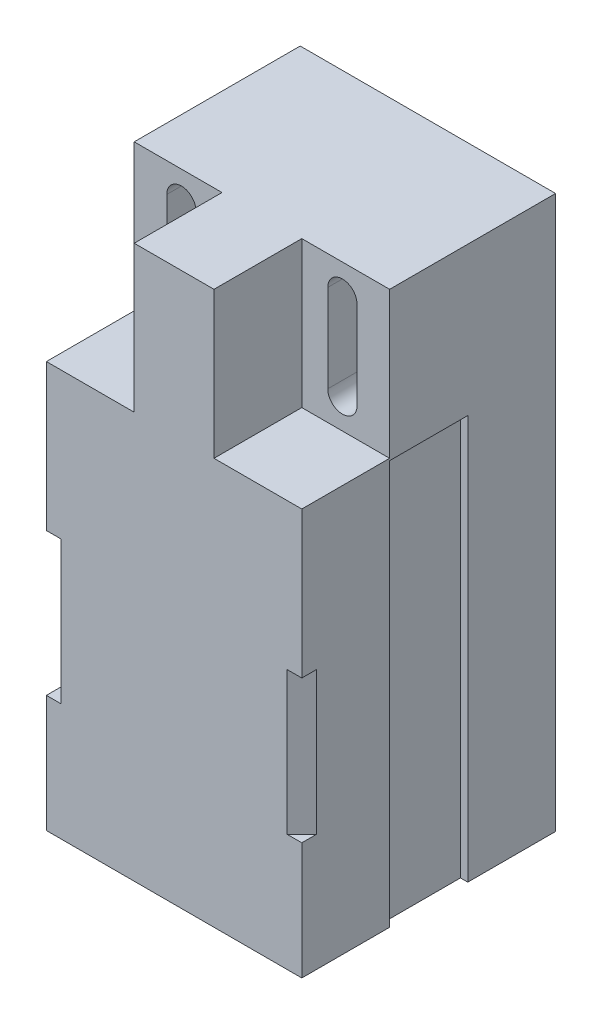
ISO-10303-21;
HEADER;
FILE_DESCRIPTION(('STEP AP214'),'2;1');
FILE_NAME('part.step','',(''),(''),'','','');
FILE_SCHEMA(('AUTOMOTIVE_DESIGN { 1 0 10303 214 1 1 1 1 }'));
ENDSEC;
DATA;
#1=APPLICATION_CONTEXT('core data for automotive mechanical design processes');
#2=APPLICATION_PROTOCOL_DEFINITION('international standard','automotive_design',2000,#1);
#3=PRODUCT_CONTEXT('',#1,'mechanical');
#4=PRODUCT('Part','Part','',(#3));
#5=PRODUCT_RELATED_PRODUCT_CATEGORY('part','',(#4));
#6=PRODUCT_DEFINITION_FORMATION('','',#4);
#7=PRODUCT_DEFINITION_CONTEXT('part definition',#1,'design');
#8=PRODUCT_DEFINITION('design','',#6,#7);
#9=PRODUCT_DEFINITION_SHAPE('','',#8);
#10=(LENGTH_UNIT() NAMED_UNIT(*) SI_UNIT(.MILLI.,.METRE.));
#11=(NAMED_UNIT(*) PLANE_ANGLE_UNIT() SI_UNIT($,.RADIAN.));
#12=(NAMED_UNIT(*) SI_UNIT($,.STERADIAN.) SOLID_ANGLE_UNIT());
#13=UNCERTAINTY_MEASURE_WITH_UNIT(LENGTH_MEASURE(1.E-05),#10,'distance_accuracy_value','');
#14=(GEOMETRIC_REPRESENTATION_CONTEXT(3) GLOBAL_UNCERTAINTY_ASSIGNED_CONTEXT((#13)) GLOBAL_UNIT_ASSIGNED_CONTEXT((#10,
#11,#12)) REPRESENTATION_CONTEXT('',''));
#15=CARTESIAN_POINT('',(0.,0.,0.));
#16=DIRECTION('',(0.,0.,1.));
#17=DIRECTION('',(1.,0.,0.));
#18=AXIS2_PLACEMENT_3D('',#15,#16,#17);
#19=CARTESIAN_POINT('',(0.,0.,17.34));
#20=DIRECTION('',(1.,0.,0.));
#21=DIRECTION('',(0.,0.,-1.));
#22=AXIS2_PLACEMENT_3D('',#19,#20,#21);
#23=PLANE('',#22);
#24=DIRECTION('',(0.,0.,-1.));
#25=VECTOR('',#24,1.);
#26=CARTESIAN_POINT('',(0.,27.5050684501862,11.34));
#27=LINE('',#26,#25);
#28=CARTESIAN_POINT('',(0.,27.5050684501862,11.34));
#29=VERTEX_POINT('',#28);
#30=CARTESIAN_POINT('',(0.,27.5050684501862,6.));
#31=VERTEX_POINT('',#30);
#32=EDGE_CURVE('E280',#29,#31,#27,.T.);
#33=ORIENTED_EDGE('',*,*,#32,.F.);
#34=DIRECTION('',(0.,1.,0.));
#35=VECTOR('',#34,1.);
#36=CARTESIAN_POINT('',(0.,27.5050684501862,11.34));
#37=LINE('',#36,#35);
#38=CARTESIAN_POINT('',(0.,0.,11.34));
#39=VERTEX_POINT('',#38);
#40=EDGE_CURVE('E265',#39,#29,#37,.T.);
#41=ORIENTED_EDGE('',*,*,#40,.F.);
#42=DIRECTION('',(0.,0.,-1.));
#43=VECTOR('',#42,1.);
#44=CARTESIAN_POINT('',(0.,0.,17.34));
#45=LINE('',#44,#43);
#46=CARTESIAN_POINT('',(0.,0.,17.34));
#47=VERTEX_POINT('',#46);
#48=EDGE_CURVE('E466',#47,#39,#45,.T.);
#49=ORIENTED_EDGE('',*,*,#48,.F.);
#50=DIRECTION('',(0.,-1.,0.));
#51=VECTOR('',#50,1.);
#52=CARTESIAN_POINT('',(0.,0.,17.34));
#53=LINE('',#52,#51);
#54=CARTESIAN_POINT('',(0.,8.,17.34));
#55=VERTEX_POINT('',#54);
#56=EDGE_CURVE('E437',#55,#47,#53,.T.);
#57=ORIENTED_EDGE('',*,*,#56,.F.);
#58=DIRECTION('',(0.,0.,-1.));
#59=VECTOR('',#58,1.);
#60=CARTESIAN_POINT('',(0.,8.,16.34));
#61=LINE('',#60,#59);
#62=CARTESIAN_POINT('',(0.,8.,16.34));
#63=VERTEX_POINT('',#62);
#64=EDGE_CURVE('E13',#55,#63,#61,.T.);
#65=ORIENTED_EDGE('',*,*,#64,.T.);
#66=DIRECTION('',(0.,1.,0.));
#67=VECTOR('',#66,1.);
#68=CARTESIAN_POINT('',(0.,0.,16.34));
#69=LINE('',#68,#67);
#70=CARTESIAN_POINT('',(0.,17.75,16.34));
#71=VERTEX_POINT('',#70);
#72=EDGE_CURVE('E56',#63,#71,#69,.T.);
#73=ORIENTED_EDGE('',*,*,#72,.T.);
#74=DIRECTION('',(0.,0.,1.));
#75=VECTOR('',#74,1.);
#76=CARTESIAN_POINT('',(0.,17.75,16.34));
#77=LINE('',#76,#75);
#78=CARTESIAN_POINT('',(0.,17.75,17.34));
#79=VERTEX_POINT('',#78);
#80=EDGE_CURVE('E489',#71,#79,#77,.T.);
#81=ORIENTED_EDGE('',*,*,#80,.T.);
#82=CARTESIAN_POINT('',(0.,27.75,17.34));
#83=VERTEX_POINT('',#82);
#84=EDGE_CURVE('E433',#83,#79,#53,.T.);
#85=ORIENTED_EDGE('',*,*,#84,.F.);
#86=DIRECTION('',(0.,0.,1.));
#87=VECTOR('',#86,1.);
#88=CARTESIAN_POINT('',(0.,27.75,11.34));
#89=LINE('',#88,#87);
#90=CARTESIAN_POINT('',(0.,27.75,11.34));
#91=VERTEX_POINT('',#90);
#92=EDGE_CURVE('E417',#91,#83,#89,.T.);
#93=ORIENTED_EDGE('',*,*,#92,.F.);
#94=DIRECTION('',(0.,-1.,0.));
#95=VECTOR('',#94,1.);
#96=CARTESIAN_POINT('',(0.,37.75,11.34));
#97=LINE('',#96,#95);
#98=CARTESIAN_POINT('',(0.,37.75,11.34));
#99=VERTEX_POINT('',#98);
#100=EDGE_CURVE('E427',#99,#91,#97,.T.);
#101=ORIENTED_EDGE('',*,*,#100,.F.);
#102=DIRECTION('',(0.,0.,-1.));
#103=VECTOR('',#102,1.);
#104=CARTESIAN_POINT('',(0.,37.75,17.34));
#105=LINE('',#104,#103);
#106=CARTESIAN_POINT('',(0.,37.75,0.));
#107=VERTEX_POINT('',#106);
#108=EDGE_CURVE('E446',#99,#107,#105,.T.);
#109=ORIENTED_EDGE('',*,*,#108,.T.);
#110=DIRECTION('',(0.,-1.,0.));
#111=VECTOR('',#110,1.);
#112=CARTESIAN_POINT('',(0.,0.,0.));
#113=LINE('',#112,#111);
#114=CARTESIAN_POINT('',(0.,0.,0.));
#115=VERTEX_POINT('',#114);
#116=EDGE_CURVE('E407',#107,#115,#113,.T.);
#117=ORIENTED_EDGE('',*,*,#116,.T.);
#118=CARTESIAN_POINT('',(0.,0.,6.));
#119=VERTEX_POINT('',#118);
#120=EDGE_CURVE('E465',#119,#115,#45,.T.);
#121=ORIENTED_EDGE('',*,*,#120,.F.);
#122=DIRECTION('',(0.,-1.,0.));
#123=VECTOR('',#122,1.);
#124=CARTESIAN_POINT('',(0.,27.5050684501862,6.));
#125=LINE('',#124,#123);
#126=EDGE_CURVE('E278',#31,#119,#125,.T.);
#127=ORIENTED_EDGE('',*,*,#126,.F.);
#128=EDGE_LOOP('',(#33,#41,#49,#57,#65,#73,#81,#85,#93,#101,#109,#117,#121,#127));
#129=FACE_BOUND('',#128,.T.);
#130=ADVANCED_FACE('F47',(#129),#23,.F.);
#131=CARTESIAN_POINT('',(0.,0.,17.34));
#132=DIRECTION('',(0.,1.,0.));
#133=DIRECTION('',(0.,0.,1.));
#134=AXIS2_PLACEMENT_3D('',#131,#132,#133);
#135=PLANE('',#134);
#136=ORIENTED_EDGE('',*,*,#48,.T.);
#137=DIRECTION('',(-1.,0.,0.));
#138=VECTOR('',#137,1.);
#139=CARTESIAN_POINT('',(0.5,0.,11.34));
#140=LINE('',#139,#138);
#141=CARTESIAN_POINT('',(0.5,0.,11.34));
#142=VERTEX_POINT('',#141);
#143=EDGE_CURVE('E287',#142,#39,#140,.T.);
#144=ORIENTED_EDGE('',*,*,#143,.F.);
#145=DIRECTION('',(0.,0.,1.));
#146=VECTOR('',#145,1.);
#147=CARTESIAN_POINT('',(0.5,0.,11.34));
#148=LINE('',#147,#146);
#149=CARTESIAN_POINT('',(0.5,0.,6.));
#150=VERTEX_POINT('',#149);
#151=EDGE_CURVE('E270',#150,#142,#148,.T.);
#152=ORIENTED_EDGE('',*,*,#151,.F.);
#153=DIRECTION('',(-1.,0.,0.));
#154=VECTOR('',#153,1.);
#155=CARTESIAN_POINT('',(0.5,0.,6.));
#156=LINE('',#155,#154);
#157=EDGE_CURVE('E290',#150,#119,#156,.T.);
#158=ORIENTED_EDGE('',*,*,#157,.T.);
#159=ORIENTED_EDGE('',*,*,#120,.T.);
#160=DIRECTION('',(1.,0.,0.));
#161=VECTOR('',#160,1.);
#162=CARTESIAN_POINT('',(0.,0.,0.));
#163=LINE('',#162,#161);
#164=CARTESIAN_POINT('',(17.45,0.,0.));
#165=VERTEX_POINT('',#164);
#166=EDGE_CURVE('E449',#115,#165,#163,.T.);
#167=ORIENTED_EDGE('',*,*,#166,.T.);
#168=DIRECTION('',(0.,0.,-1.));
#169=VECTOR('',#168,1.);
#170=CARTESIAN_POINT('',(17.45,0.,17.34));
#171=LINE('',#170,#169);
#172=CARTESIAN_POINT('',(17.45,0.,6.));
#173=VERTEX_POINT('',#172);
#174=EDGE_CURVE('E461',#173,#165,#171,.T.);
#175=ORIENTED_EDGE('',*,*,#174,.F.);
#176=DIRECTION('',(1.,0.,0.));
#177=VECTOR('',#176,1.);
#178=CARTESIAN_POINT('',(16.95,0.,6.));
#179=LINE('',#178,#177);
#180=CARTESIAN_POINT('',(16.95,0.,6.));
#181=VERTEX_POINT('',#180);
#182=EDGE_CURVE('E72',#181,#173,#179,.T.);
#183=ORIENTED_EDGE('',*,*,#182,.F.);
#184=DIRECTION('',(0.,0.,-1.));
#185=VECTOR('',#184,1.);
#186=CARTESIAN_POINT('',(16.95,0.,11.34));
#187=LINE('',#186,#185);
#188=CARTESIAN_POINT('',(16.95,0.,11.34));
#189=VERTEX_POINT('',#188);
#190=EDGE_CURVE('E297',#189,#181,#187,.T.);
#191=ORIENTED_EDGE('',*,*,#190,.F.);
#192=DIRECTION('',(1.,0.,0.));
#193=VECTOR('',#192,1.);
#194=CARTESIAN_POINT('',(16.95,0.,11.34));
#195=LINE('',#194,#193);
#196=CARTESIAN_POINT('',(17.45,0.,11.34));
#197=VERTEX_POINT('',#196);
#198=EDGE_CURVE('E307',#189,#197,#195,.T.);
#199=ORIENTED_EDGE('',*,*,#198,.T.);
#200=CARTESIAN_POINT('',(17.45,0.,17.34));
#201=VERTEX_POINT('',#200);
#202=EDGE_CURVE('E462',#201,#197,#171,.T.);
#203=ORIENTED_EDGE('',*,*,#202,.F.);
#204=DIRECTION('',(1.,0.,0.));
#205=VECTOR('',#204,1.);
#206=CARTESIAN_POINT('',(0.,0.,17.34));
#207=LINE('',#206,#205);
#208=EDGE_CURVE('E436',#47,#201,#207,.T.);
#209=ORIENTED_EDGE('',*,*,#208,.F.);
#210=EDGE_LOOP('',(#136,#144,#152,#158,#159,#167,#175,#183,#191,#199,#203,#209));
#211=FACE_BOUND('',#210,.T.);
#212=ADVANCED_FACE('F515',(#211),#135,.F.);
#213=CARTESIAN_POINT('',(17.45,0.,17.34));
#214=DIRECTION('',(-1.,0.,0.));
#215=DIRECTION('',(0.,0.,1.));
#216=AXIS2_PLACEMENT_3D('',#213,#214,#215);
#217=PLANE('',#216);
#218=ORIENTED_EDGE('',*,*,#202,.T.);
#219=DIRECTION('',(0.,-1.,0.));
#220=VECTOR('',#219,1.);
#221=CARTESIAN_POINT('',(17.45,27.6100841132299,11.34));
#222=LINE('',#221,#220);
#223=CARTESIAN_POINT('',(17.45,27.6100841132299,11.34));
#224=VERTEX_POINT('',#223);
#225=EDGE_CURVE('E289',#224,#197,#222,.T.);
#226=ORIENTED_EDGE('',*,*,#225,.F.);
#227=DIRECTION('',(0.,0.,1.));
#228=VECTOR('',#227,1.);
#229=CARTESIAN_POINT('',(17.45,27.6100841132299,11.34));
#230=LINE('',#229,#228);
#231=CARTESIAN_POINT('',(17.45,27.6100841132299,6.));
#232=VERTEX_POINT('',#231);
#233=EDGE_CURVE('E298',#232,#224,#230,.T.);
#234=ORIENTED_EDGE('',*,*,#233,.F.);
#235=DIRECTION('',(0.,1.,0.));
#236=VECTOR('',#235,1.);
#237=CARTESIAN_POINT('',(17.45,27.6100841132299,6.));
#238=LINE('',#237,#236);
#239=EDGE_CURVE('E309',#173,#232,#238,.T.);
#240=ORIENTED_EDGE('',*,*,#239,.F.);
#241=ORIENTED_EDGE('',*,*,#174,.T.);
#242=DIRECTION('',(0.,1.,0.));
#243=VECTOR('',#242,1.);
#244=CARTESIAN_POINT('',(17.45,0.,0.));
#245=LINE('',#244,#243);
#246=CARTESIAN_POINT('',(17.45,37.75,0.));
#247=VERTEX_POINT('',#246);
#248=EDGE_CURVE('E452',#165,#247,#245,.T.);
#249=ORIENTED_EDGE('',*,*,#248,.T.);
#250=DIRECTION('',(0.,0.,-1.));
#251=VECTOR('',#250,1.);
#252=CARTESIAN_POINT('',(17.45,37.75,17.34));
#253=LINE('',#252,#251);
#254=CARTESIAN_POINT('',(17.45,37.75,11.34));
#255=VERTEX_POINT('',#254);
#256=EDGE_CURVE('E459',#255,#247,#253,.T.);
#257=ORIENTED_EDGE('',*,*,#256,.F.);
#258=DIRECTION('',(0.,1.,0.));
#259=VECTOR('',#258,1.);
#260=CARTESIAN_POINT('',(17.45,37.75,11.34));
#261=LINE('',#260,#259);
#262=CARTESIAN_POINT('',(17.45,27.75,11.34));
#263=VERTEX_POINT('',#262);
#264=EDGE_CURVE('E394',#263,#255,#261,.T.);
#265=ORIENTED_EDGE('',*,*,#264,.F.);
#266=DIRECTION('',(0.,0.,1.));
#267=VECTOR('',#266,1.);
#268=CARTESIAN_POINT('',(17.45,27.75,11.34));
#269=LINE('',#268,#267);
#270=CARTESIAN_POINT('',(17.45,27.75,17.34));
#271=VERTEX_POINT('',#270);
#272=EDGE_CURVE('E408',#263,#271,#269,.T.);
#273=ORIENTED_EDGE('',*,*,#272,.T.);
#274=DIRECTION('',(0.,1.,0.));
#275=VECTOR('',#274,1.);
#276=CARTESIAN_POINT('',(17.45,0.,17.34));
#277=LINE('',#276,#275);
#278=CARTESIAN_POINT('',(17.45,17.75,17.34));
#279=VERTEX_POINT('',#278);
#280=EDGE_CURVE('E439',#279,#271,#277,.T.);
#281=ORIENTED_EDGE('',*,*,#280,.F.);
#282=DIRECTION('',(0.,0.,-1.));
#283=VECTOR('',#282,1.);
#284=CARTESIAN_POINT('',(17.45,17.75,16.34));
#285=LINE('',#284,#283);
#286=CARTESIAN_POINT('',(17.45,17.75,16.34));
#287=VERTEX_POINT('',#286);
#288=EDGE_CURVE('E487',#279,#287,#285,.T.);
#289=ORIENTED_EDGE('',*,*,#288,.T.);
#290=DIRECTION('',(0.,-1.,0.));
#291=VECTOR('',#290,1.);
#292=CARTESIAN_POINT('',(17.45,0.,16.34));
#293=LINE('',#292,#291);
#294=CARTESIAN_POINT('',(17.45,8.,16.34));
#295=VERTEX_POINT('',#294);
#296=EDGE_CURVE('E485',#287,#295,#293,.T.);
#297=ORIENTED_EDGE('',*,*,#296,.T.);
#298=DIRECTION('',(0.,0.,1.));
#299=VECTOR('',#298,1.);
#300=CARTESIAN_POINT('',(17.45,8.,16.34));
#301=LINE('',#300,#299);
#302=CARTESIAN_POINT('',(17.45,8.,17.34));
#303=VERTEX_POINT('',#302);
#304=EDGE_CURVE('E483',#295,#303,#301,.T.);
#305=ORIENTED_EDGE('',*,*,#304,.T.);
#306=EDGE_CURVE('E440',#201,#303,#277,.T.);
#307=ORIENTED_EDGE('',*,*,#306,.F.);
#308=EDGE_LOOP('',(#218,#226,#234,#240,#241,#249,#257,#265,#273,#281,#289,#297,#305,#307));
#309=FACE_BOUND('',#308,.T.);
#310=ADVANCED_FACE('F534',(#309),#217,.F.);
#311=CARTESIAN_POINT('',(0.,37.75,17.34));
#312=DIRECTION('',(0.,-1.,0.));
#313=DIRECTION('',(0.,0.,-1.));
#314=AXIS2_PLACEMENT_3D('',#311,#312,#313);
#315=PLANE('',#314);
#316=DIRECTION('',(-1.,0.,0.));
#317=VECTOR('',#316,1.);
#318=CARTESIAN_POINT('',(0.,37.75,17.34));
#319=LINE('',#318,#317);
#320=CARTESIAN_POINT('',(11.45,37.75,17.34));
#321=VERTEX_POINT('',#320);
#322=CARTESIAN_POINT('',(6.,37.75,17.34));
#323=VERTEX_POINT('',#322);
#324=EDGE_CURVE('E443',#321,#323,#319,.T.);
#325=ORIENTED_EDGE('',*,*,#324,.F.);
#326=DIRECTION('',(0.,0.,1.));
#327=VECTOR('',#326,1.);
#328=CARTESIAN_POINT('',(11.45,37.75,11.34));
#329=LINE('',#328,#327);
#330=CARTESIAN_POINT('',(11.45,37.75,11.34));
#331=VERTEX_POINT('',#330);
#332=EDGE_CURVE('E405',#331,#321,#329,.T.);
#333=ORIENTED_EDGE('',*,*,#332,.F.);
#334=DIRECTION('',(-1.,0.,0.));
#335=VECTOR('',#334,1.);
#336=CARTESIAN_POINT('',(11.45,37.75,11.34));
#337=LINE('',#336,#335);
#338=EDGE_CURVE('E396',#255,#331,#337,.T.);
#339=ORIENTED_EDGE('',*,*,#338,.F.);
#340=ORIENTED_EDGE('',*,*,#256,.T.);
#341=DIRECTION('',(-1.,0.,0.));
#342=VECTOR('',#341,1.);
#343=CARTESIAN_POINT('',(0.,37.75,0.));
#344=LINE('',#343,#342);
#345=EDGE_CURVE('E455',#247,#107,#344,.T.);
#346=ORIENTED_EDGE('',*,*,#345,.T.);
#347=ORIENTED_EDGE('',*,*,#108,.F.);
#348=DIRECTION('',(-1.,0.,0.));
#349=VECTOR('',#348,1.);
#350=CARTESIAN_POINT('',(6.,37.75,11.34));
#351=LINE('',#350,#349);
#352=CARTESIAN_POINT('',(6.,37.75,11.34));
#353=VERTEX_POINT('',#352);
#354=EDGE_CURVE('E429',#353,#99,#351,.T.);
#355=ORIENTED_EDGE('',*,*,#354,.F.);
#356=DIRECTION('',(0.,0.,1.));
#357=VECTOR('',#356,1.);
#358=CARTESIAN_POINT('',(6.,37.75,11.34));
#359=LINE('',#358,#357);
#360=EDGE_CURVE('E413',#353,#323,#359,.T.);
#361=ORIENTED_EDGE('',*,*,#360,.T.);
#362=EDGE_LOOP('',(#325,#333,#339,#340,#346,#347,#355,#361));
#363=FACE_BOUND('',#362,.T.);
#364=ADVANCED_FACE('F547',(#363),#315,.F.);
#365=CARTESIAN_POINT('',(0.,0.,17.34));
#366=DIRECTION('',(0.,0.,-1.));
#367=DIRECTION('',(-1.,0.,0.));
#368=AXIS2_PLACEMENT_3D('',#365,#366,#367);
#369=PLANE('',#368);
#370=ORIENTED_EDGE('',*,*,#306,.T.);
#371=DIRECTION('',(-1.,0.,0.));
#372=VECTOR('',#371,1.);
#373=CARTESIAN_POINT('',(16.45,8.,17.34));
#374=LINE('',#373,#372);
#375=CARTESIAN_POINT('',(16.45,8.,17.34));
#376=VERTEX_POINT('',#375);
#377=EDGE_CURVE('E480',#303,#376,#374,.T.);
#378=ORIENTED_EDGE('',*,*,#377,.T.);
#379=DIRECTION('',(0.,1.,0.));
#380=VECTOR('',#379,1.);
#381=CARTESIAN_POINT('',(16.45,0.,17.34));
#382=LINE('',#381,#380);
#383=CARTESIAN_POINT('',(16.45,17.75,17.34));
#384=VERTEX_POINT('',#383);
#385=EDGE_CURVE('E478',#376,#384,#382,.T.);
#386=ORIENTED_EDGE('',*,*,#385,.T.);
#387=DIRECTION('',(1.,0.,0.));
#388=VECTOR('',#387,1.);
#389=CARTESIAN_POINT('',(16.45,17.75,17.34));
#390=LINE('',#389,#388);
#391=EDGE_CURVE('E476',#384,#279,#390,.T.);
#392=ORIENTED_EDGE('',*,*,#391,.T.);
#393=ORIENTED_EDGE('',*,*,#280,.T.);
#394=DIRECTION('',(1.,0.,0.));
#395=VECTOR('',#394,1.);
#396=CARTESIAN_POINT('',(11.45,27.75,17.34));
#397=LINE('',#396,#395);
#398=CARTESIAN_POINT('',(11.45,27.75,17.34));
#399=VERTEX_POINT('',#398);
#400=EDGE_CURVE('E391',#399,#271,#397,.T.);
#401=ORIENTED_EDGE('',*,*,#400,.F.);
#402=DIRECTION('',(0.,-1.,0.));
#403=VECTOR('',#402,1.);
#404=CARTESIAN_POINT('',(11.45,37.75,17.34));
#405=LINE('',#404,#403);
#406=EDGE_CURVE('E400',#321,#399,#405,.T.);
#407=ORIENTED_EDGE('',*,*,#406,.F.);
#408=ORIENTED_EDGE('',*,*,#324,.T.);
#409=DIRECTION('',(0.,1.,0.));
#410=VECTOR('',#409,1.);
#411=CARTESIAN_POINT('',(6.,37.75,17.34));
#412=LINE('',#411,#410);
#413=CARTESIAN_POINT('',(6.,27.75,17.34));
#414=VERTEX_POINT('',#413);
#415=EDGE_CURVE('E402',#414,#323,#412,.T.);
#416=ORIENTED_EDGE('',*,*,#415,.F.);
#417=DIRECTION('',(1.,0.,0.));
#418=VECTOR('',#417,1.);
#419=CARTESIAN_POINT('',(6.,27.75,17.34));
#420=LINE('',#419,#418);
#421=EDGE_CURVE('E420',#83,#414,#420,.T.);
#422=ORIENTED_EDGE('',*,*,#421,.F.);
#423=ORIENTED_EDGE('',*,*,#84,.T.);
#424=DIRECTION('',(1.,0.,0.));
#425=VECTOR('',#424,1.);
#426=CARTESIAN_POINT('',(1.,17.75,17.34));
#427=LINE('',#426,#425);
#428=CARTESIAN_POINT('',(1.,17.75,17.34));
#429=VERTEX_POINT('',#428);
#430=EDGE_CURVE('E473',#79,#429,#427,.T.);
#431=ORIENTED_EDGE('',*,*,#430,.T.);
#432=DIRECTION('',(0.,-1.,0.));
#433=VECTOR('',#432,1.);
#434=CARTESIAN_POINT('',(1.,0.,17.34));
#435=LINE('',#434,#433);
#436=CARTESIAN_POINT('',(1.,8.,17.34));
#437=VERTEX_POINT('',#436);
#438=EDGE_CURVE('E471',#429,#437,#435,.T.);
#439=ORIENTED_EDGE('',*,*,#438,.T.);
#440=DIRECTION('',(-1.,0.,0.));
#441=VECTOR('',#440,1.);
#442=CARTESIAN_POINT('',(1.,8.,17.34));
#443=LINE('',#442,#441);
#444=EDGE_CURVE('E469',#437,#55,#443,.T.);
#445=ORIENTED_EDGE('',*,*,#444,.T.);
#446=ORIENTED_EDGE('',*,*,#56,.T.);
#447=ORIENTED_EDGE('',*,*,#208,.T.);
#448=EDGE_LOOP('',(#370,#378,#386,#392,#393,#401,#407,#408,#416,#422,#423,#431,#439,#445,#446,#447));
#449=FACE_BOUND('',#448,.T.);
#450=ADVANCED_FACE('F510',(#449),#369,.F.);
#451=CARTESIAN_POINT('',(0.,0.,0.));
#452=DIRECTION('',(0.,0.,-1.));
#453=DIRECTION('',(-1.,0.,0.));
#454=AXIS2_PLACEMENT_3D('',#451,#452,#453);
#455=PLANE('',#454);
#456=CARTESIAN_POINT('',(14.225,29.75,0.));
#457=DIRECTION('',(0.,0.,1.));
#458=DIRECTION('',(1.,0.,0.));
#459=AXIS2_PLACEMENT_3D('',#456,#457,#458);
#460=CIRCLE('',#459,0.999999999999999);
#461=CARTESIAN_POINT('',(13.225,29.75,0.));
#462=VERTEX_POINT('',#461);
#463=CARTESIAN_POINT('',(15.225,29.75,0.));
#464=VERTEX_POINT('',#463);
#465=EDGE_CURVE('E321',#462,#464,#460,.T.);
#466=ORIENTED_EDGE('',*,*,#465,.T.);
#467=DIRECTION('',(0.,1.,0.));
#468=VECTOR('',#467,1.);
#469=CARTESIAN_POINT('',(15.225,29.75,0.));
#470=LINE('',#469,#468);
#471=CARTESIAN_POINT('',(15.225,35.75,0.));
#472=VERTEX_POINT('',#471);
#473=EDGE_CURVE('E324',#464,#472,#470,.T.);
#474=ORIENTED_EDGE('',*,*,#473,.T.);
#475=CARTESIAN_POINT('',(14.225,35.75,0.));
#476=DIRECTION('',(0.,0.,1.));
#477=DIRECTION('',(1.,0.,0.));
#478=AXIS2_PLACEMENT_3D('',#475,#476,#477);
#479=CIRCLE('',#478,0.999999999999999);
#480=CARTESIAN_POINT('',(13.225,35.75,0.));
#481=VERTEX_POINT('',#480);
#482=EDGE_CURVE('E328',#472,#481,#479,.T.);
#483=ORIENTED_EDGE('',*,*,#482,.T.);
#484=DIRECTION('',(0.,-1.,0.));
#485=VECTOR('',#484,1.);
#486=CARTESIAN_POINT('',(13.225,29.75,0.));
#487=LINE('',#486,#485);
#488=EDGE_CURVE('E331',#481,#462,#487,.T.);
#489=ORIENTED_EDGE('',*,*,#488,.T.);
#490=EDGE_LOOP('',(#466,#474,#483,#489));
#491=FACE_BOUND('',#490,.T.);
#492=CARTESIAN_POINT('',(3.225,29.75,0.));
#493=DIRECTION('',(0.,0.,1.));
#494=DIRECTION('',(1.,0.,0.));
#495=AXIS2_PLACEMENT_3D('',#492,#493,#494);
#496=CIRCLE('',#495,1.);
#497=CARTESIAN_POINT('',(2.225,29.75,0.));
#498=VERTEX_POINT('',#497);
#499=CARTESIAN_POINT('',(4.225,29.75,0.));
#500=VERTEX_POINT('',#499);
#501=EDGE_CURVE('E370',#498,#500,#496,.T.);
#502=ORIENTED_EDGE('',*,*,#501,.T.);
#503=DIRECTION('',(0.,1.,0.));
#504=VECTOR('',#503,1.);
#505=CARTESIAN_POINT('',(4.225,29.75,0.));
#506=LINE('',#505,#504);
#507=CARTESIAN_POINT('',(4.225,35.75,0.));
#508=VERTEX_POINT('',#507);
#509=EDGE_CURVE('E382',#500,#508,#506,.T.);
#510=ORIENTED_EDGE('',*,*,#509,.T.);
#511=CARTESIAN_POINT('',(3.225,35.75,0.));
#512=DIRECTION('',(0.,0.,1.));
#513=DIRECTION('',(1.,0.,0.));
#514=AXIS2_PLACEMENT_3D('',#511,#512,#513);
#515=CIRCLE('',#514,1.);
#516=CARTESIAN_POINT('',(2.225,35.75,0.));
#517=VERTEX_POINT('',#516);
#518=EDGE_CURVE('E379',#508,#517,#515,.T.);
#519=ORIENTED_EDGE('',*,*,#518,.T.);
#520=DIRECTION('',(0.,-1.,0.));
#521=VECTOR('',#520,1.);
#522=CARTESIAN_POINT('',(2.225,29.75,0.));
#523=LINE('',#522,#521);
#524=EDGE_CURVE('E358',#517,#498,#523,.T.);
#525=ORIENTED_EDGE('',*,*,#524,.T.);
#526=EDGE_LOOP('',(#502,#510,#519,#525));
#527=FACE_BOUND('',#526,.T.);
#528=ORIENTED_EDGE('',*,*,#116,.F.);
#529=ORIENTED_EDGE('',*,*,#345,.F.);
#530=ORIENTED_EDGE('',*,*,#248,.F.);
#531=ORIENTED_EDGE('',*,*,#166,.F.);
#532=EDGE_LOOP('',(#528,#529,#530,#531));
#533=FACE_BOUND('',#532,.T.);
#534=ADVANCED_FACE('F625',(#491,#527,#533),#455,.T.);
#535=CARTESIAN_POINT('',(6.,37.75,11.34));
#536=DIRECTION('',(1.,0.,0.));
#537=DIRECTION('',(0.,1.,0.));
#538=AXIS2_PLACEMENT_3D('',#535,#536,#537);
#539=PLANE('',#538);
#540=ORIENTED_EDGE('',*,*,#415,.T.);
#541=ORIENTED_EDGE('',*,*,#360,.F.);
#542=DIRECTION('',(0.,1.,0.));
#543=VECTOR('',#542,1.);
#544=CARTESIAN_POINT('',(6.,37.75,11.34));
#545=LINE('',#544,#543);
#546=CARTESIAN_POINT('',(6.,27.75,11.34));
#547=VERTEX_POINT('',#546);
#548=EDGE_CURVE('E423',#547,#353,#545,.T.);
#549=ORIENTED_EDGE('',*,*,#548,.F.);
#550=DIRECTION('',(0.,0.,1.));
#551=VECTOR('',#550,1.);
#552=CARTESIAN_POINT('',(6.,27.75,11.34));
#553=LINE('',#552,#551);
#554=EDGE_CURVE('E348',#547,#414,#553,.T.);
#555=ORIENTED_EDGE('',*,*,#554,.T.);
#556=EDGE_LOOP('',(#540,#541,#549,#555));
#557=FACE_BOUND('',#556,.T.);
#558=ADVANCED_FACE('F553',(#557),#539,.F.);
#559=CARTESIAN_POINT('',(6.,27.75,11.34));
#560=DIRECTION('',(0.,-1.,0.));
#561=DIRECTION('',(0.,0.,-1.));
#562=AXIS2_PLACEMENT_3D('',#559,#560,#561);
#563=PLANE('',#562);
#564=ORIENTED_EDGE('',*,*,#421,.T.);
#565=ORIENTED_EDGE('',*,*,#554,.F.);
#566=DIRECTION('',(1.,0.,0.));
#567=VECTOR('',#566,1.);
#568=CARTESIAN_POINT('',(6.,27.75,11.34));
#569=LINE('',#568,#567);
#570=EDGE_CURVE('E416',#91,#547,#569,.T.);
#571=ORIENTED_EDGE('',*,*,#570,.F.);
#572=ORIENTED_EDGE('',*,*,#92,.T.);
#573=EDGE_LOOP('',(#564,#565,#571,#572));
#574=FACE_BOUND('',#573,.T.);
#575=ADVANCED_FACE('F560',(#574),#563,.F.);
#576=CARTESIAN_POINT('',(0.,0.,11.34));
#577=DIRECTION('',(0.,0.,-1.));
#578=DIRECTION('',(-1.,0.,0.));
#579=AXIS2_PLACEMENT_3D('',#576,#577,#578);
#580=PLANE('',#579);
#581=DIRECTION('',(0.,1.,0.));
#582=VECTOR('',#581,1.);
#583=CARTESIAN_POINT('',(4.225,29.75,11.34));
#584=LINE('',#583,#582);
#585=CARTESIAN_POINT('',(4.225,29.75,11.34));
#586=VERTEX_POINT('',#585);
#587=CARTESIAN_POINT('',(4.225,35.75,11.34));
#588=VERTEX_POINT('',#587);
#589=EDGE_CURVE('E373',#586,#588,#584,.T.);
#590=ORIENTED_EDGE('',*,*,#589,.F.);
#591=CARTESIAN_POINT('',(3.225,29.75,11.34));
#592=DIRECTION('',(0.,0.,1.));
#593=DIRECTION('',(1.,0.,0.));
#594=AXIS2_PLACEMENT_3D('',#591,#592,#593);
#595=CIRCLE('',#594,1.);
#596=CARTESIAN_POINT('',(2.225,29.75,11.34));
#597=VERTEX_POINT('',#596);
#598=EDGE_CURVE('E338',#597,#586,#595,.T.);
#599=ORIENTED_EDGE('',*,*,#598,.F.);
#600=DIRECTION('',(0.,-1.,0.));
#601=VECTOR('',#600,1.);
#602=CARTESIAN_POINT('',(2.225,29.75,11.34));
#603=LINE('',#602,#601);
#604=CARTESIAN_POINT('',(2.225,35.75,11.34));
#605=VERTEX_POINT('',#604);
#606=EDGE_CURVE('E366',#605,#597,#603,.T.);
#607=ORIENTED_EDGE('',*,*,#606,.F.);
#608=CARTESIAN_POINT('',(3.225,35.75,11.34));
#609=DIRECTION('',(0.,0.,1.));
#610=DIRECTION('',(1.,0.,0.));
#611=AXIS2_PLACEMENT_3D('',#608,#609,#610);
#612=CIRCLE('',#611,1.);
#613=EDGE_CURVE('E369',#588,#605,#612,.T.);
#614=ORIENTED_EDGE('',*,*,#613,.F.);
#615=EDGE_LOOP('',(#590,#599,#607,#614));
#616=FACE_BOUND('',#615,.T.);
#617=ORIENTED_EDGE('',*,*,#548,.T.);
#618=ORIENTED_EDGE('',*,*,#354,.T.);
#619=ORIENTED_EDGE('',*,*,#100,.T.);
#620=ORIENTED_EDGE('',*,*,#570,.T.);
#621=EDGE_LOOP('',(#617,#618,#619,#620));
#622=FACE_BOUND('',#621,.T.);
#623=ADVANCED_FACE('F555',(#616,#622),#580,.F.);
#624=CARTESIAN_POINT('',(11.45,37.75,11.34));
#625=DIRECTION('',(-1.,0.,0.));
#626=DIRECTION('',(0.,-1.,0.));
#627=AXIS2_PLACEMENT_3D('',#624,#625,#626);
#628=PLANE('',#627);
#629=ORIENTED_EDGE('',*,*,#406,.T.);
#630=DIRECTION('',(0.,0.,1.));
#631=VECTOR('',#630,1.);
#632=CARTESIAN_POINT('',(11.45,27.75,11.34));
#633=LINE('',#632,#631);
#634=CARTESIAN_POINT('',(11.45,27.75,11.34));
#635=VERTEX_POINT('',#634);
#636=EDGE_CURVE('E399',#635,#399,#633,.T.);
#637=ORIENTED_EDGE('',*,*,#636,.F.);
#638=DIRECTION('',(0.,-1.,0.));
#639=VECTOR('',#638,1.);
#640=CARTESIAN_POINT('',(11.45,37.75,11.34));
#641=LINE('',#640,#639);
#642=EDGE_CURVE('E387',#331,#635,#641,.T.);
#643=ORIENTED_EDGE('',*,*,#642,.F.);
#644=ORIENTED_EDGE('',*,*,#332,.T.);
#645=EDGE_LOOP('',(#629,#637,#643,#644));
#646=FACE_BOUND('',#645,.T.);
#647=ADVANCED_FACE('F542',(#646),#628,.F.);
#648=CARTESIAN_POINT('',(11.45,27.75,11.34));
#649=DIRECTION('',(0.,-1.,0.));
#650=DIRECTION('',(0.,0.,-1.));
#651=AXIS2_PLACEMENT_3D('',#648,#649,#650);
#652=PLANE('',#651);
#653=ORIENTED_EDGE('',*,*,#400,.T.);
#654=ORIENTED_EDGE('',*,*,#272,.F.);
#655=DIRECTION('',(1.,0.,0.));
#656=VECTOR('',#655,1.);
#657=CARTESIAN_POINT('',(11.45,27.75,11.34));
#658=LINE('',#657,#656);
#659=EDGE_CURVE('E390',#635,#263,#658,.T.);
#660=ORIENTED_EDGE('',*,*,#659,.F.);
#661=ORIENTED_EDGE('',*,*,#636,.T.);
#662=EDGE_LOOP('',(#653,#654,#660,#661));
#663=FACE_BOUND('',#662,.T.);
#664=ADVANCED_FACE('F539',(#663),#652,.F.);
#665=CARTESIAN_POINT('',(0.,0.,11.34));
#666=DIRECTION('',(0.,0.,1.));
#667=DIRECTION('',(1.,0.,0.));
#668=AXIS2_PLACEMENT_3D('',#665,#666,#667);
#669=PLANE('',#668);
#670=CARTESIAN_POINT('',(14.225,29.75,11.34));
#671=DIRECTION('',(0.,0.,1.));
#672=DIRECTION('',(1.,0.,0.));
#673=AXIS2_PLACEMENT_3D('',#670,#671,#672);
#674=CIRCLE('',#673,0.999999999999999);
#675=CARTESIAN_POINT('',(13.225,29.75,11.34));
#676=VERTEX_POINT('',#675);
#677=CARTESIAN_POINT('',(15.225,29.75,11.34));
#678=VERTEX_POINT('',#677);
#679=EDGE_CURVE('E335',#676,#678,#674,.T.);
#680=ORIENTED_EDGE('',*,*,#679,.F.);
#681=DIRECTION('',(0.,-1.,0.));
#682=VECTOR('',#681,1.);
#683=CARTESIAN_POINT('',(13.225,29.75,11.34));
#684=LINE('',#683,#682);
#685=CARTESIAN_POINT('',(13.225,35.75,11.34));
#686=VERTEX_POINT('',#685);
#687=EDGE_CURVE('E325',#686,#676,#684,.T.);
#688=ORIENTED_EDGE('',*,*,#687,.F.);
#689=CARTESIAN_POINT('',(14.225,35.75,11.34));
#690=DIRECTION('',(0.,0.,1.));
#691=DIRECTION('',(1.,0.,0.));
#692=AXIS2_PLACEMENT_3D('',#689,#690,#691);
#693=CIRCLE('',#692,0.999999999999999);
#694=CARTESIAN_POINT('',(15.225,35.75,11.34));
#695=VERTEX_POINT('',#694);
#696=EDGE_CURVE('E341',#695,#686,#693,.T.);
#697=ORIENTED_EDGE('',*,*,#696,.F.);
#698=DIRECTION('',(0.,1.,0.));
#699=VECTOR('',#698,1.);
#700=CARTESIAN_POINT('',(15.225,29.75,11.34));
#701=LINE('',#700,#699);
#702=EDGE_CURVE('E337',#678,#695,#701,.T.);
#703=ORIENTED_EDGE('',*,*,#702,.F.);
#704=EDGE_LOOP('',(#680,#688,#697,#703));
#705=FACE_BOUND('',#704,.T.);
#706=ORIENTED_EDGE('',*,*,#642,.T.);
#707=ORIENTED_EDGE('',*,*,#659,.T.);
#708=ORIENTED_EDGE('',*,*,#264,.T.);
#709=ORIENTED_EDGE('',*,*,#338,.T.);
#710=EDGE_LOOP('',(#706,#707,#708,#709));
#711=FACE_BOUND('',#710,.T.);
#712=ADVANCED_FACE('F614',(#705,#711),#669,.T.);
#713=CARTESIAN_POINT('',(14.225,29.75,0.));
#714=DIRECTION('',(0.,0.,1.));
#715=DIRECTION('',(1.,0.,0.));
#716=AXIS2_PLACEMENT_3D('',#713,#714,#715);
#717=CYLINDRICAL_SURFACE('',#716,0.999999999999999);
#718=ORIENTED_EDGE('',*,*,#679,.T.);
#719=DIRECTION('',(0.,0.,1.));
#720=VECTOR('',#719,1.);
#721=CARTESIAN_POINT('',(15.225,29.75,0.));
#722=LINE('',#721,#720);
#723=EDGE_CURVE('E334',#464,#678,#722,.T.);
#724=ORIENTED_EDGE('',*,*,#723,.F.);
#725=ORIENTED_EDGE('',*,*,#465,.F.);
#726=DIRECTION('',(0.,0.,1.));
#727=VECTOR('',#726,1.);
#728=CARTESIAN_POINT('',(13.225,29.75,0.));
#729=LINE('',#728,#727);
#730=EDGE_CURVE('E346',#462,#676,#729,.T.);
#731=ORIENTED_EDGE('',*,*,#730,.T.);
#732=EDGE_LOOP('',(#718,#724,#725,#731));
#733=FACE_BOUND('',#732,.T.);
#734=ADVANCED_FACE('F617',(#733),#717,.F.);
#735=CARTESIAN_POINT('',(13.225,29.75,0.));
#736=DIRECTION('',(-1.,0.,0.));
#737=DIRECTION('',(0.,0.,1.));
#738=AXIS2_PLACEMENT_3D('',#735,#736,#737);
#739=PLANE('',#738);
#740=ORIENTED_EDGE('',*,*,#687,.T.);
#741=ORIENTED_EDGE('',*,*,#730,.F.);
#742=ORIENTED_EDGE('',*,*,#488,.F.);
#743=DIRECTION('',(0.,0.,1.));
#744=VECTOR('',#743,1.);
#745=CARTESIAN_POINT('',(13.225,35.75,0.));
#746=LINE('',#745,#744);
#747=EDGE_CURVE('E349',#481,#686,#746,.T.);
#748=ORIENTED_EDGE('',*,*,#747,.T.);
#749=EDGE_LOOP('',(#740,#741,#742,#748));
#750=FACE_BOUND('',#749,.T.);
#751=ADVANCED_FACE('F708',(#750),#739,.F.);
#752=CARTESIAN_POINT('',(14.225,35.75,0.));
#753=DIRECTION('',(0.,0.,1.));
#754=DIRECTION('',(1.,0.,0.));
#755=AXIS2_PLACEMENT_3D('',#752,#753,#754);
#756=CYLINDRICAL_SURFACE('',#755,0.999999999999999);
#757=ORIENTED_EDGE('',*,*,#696,.T.);
#758=ORIENTED_EDGE('',*,*,#747,.F.);
#759=ORIENTED_EDGE('',*,*,#482,.F.);
#760=DIRECTION('',(0.,0.,1.));
#761=VECTOR('',#760,1.);
#762=CARTESIAN_POINT('',(15.225,35.75,0.));
#763=LINE('',#762,#761);
#764=EDGE_CURVE('E351',#472,#695,#763,.T.);
#765=ORIENTED_EDGE('',*,*,#764,.T.);
#766=EDGE_LOOP('',(#757,#758,#759,#765));
#767=FACE_BOUND('',#766,.T.);
#768=ADVANCED_FACE('F711',(#767),#756,.F.);
#769=CARTESIAN_POINT('',(15.225,29.75,0.));
#770=DIRECTION('',(1.,0.,0.));
#771=DIRECTION('',(0.,0.,-1.));
#772=AXIS2_PLACEMENT_3D('',#769,#770,#771);
#773=PLANE('',#772);
#774=ORIENTED_EDGE('',*,*,#702,.T.);
#775=ORIENTED_EDGE('',*,*,#764,.F.);
#776=ORIENTED_EDGE('',*,*,#473,.F.);
#777=ORIENTED_EDGE('',*,*,#723,.T.);
#778=EDGE_LOOP('',(#774,#775,#776,#777));
#779=FACE_BOUND('',#778,.T.);
#780=ADVANCED_FACE('F715',(#779),#773,.F.);
#781=CARTESIAN_POINT('',(3.225,29.75,0.));
#782=DIRECTION('',(0.,0.,1.));
#783=DIRECTION('',(1.,0.,0.));
#784=AXIS2_PLACEMENT_3D('',#781,#782,#783);
#785=CYLINDRICAL_SURFACE('',#784,1.);
#786=ORIENTED_EDGE('',*,*,#598,.T.);
#787=DIRECTION('',(0.,0.,1.));
#788=VECTOR('',#787,1.);
#789=CARTESIAN_POINT('',(4.225,29.75,0.));
#790=LINE('',#789,#788);
#791=EDGE_CURVE('E355',#500,#586,#790,.T.);
#792=ORIENTED_EDGE('',*,*,#791,.F.);
#793=ORIENTED_EDGE('',*,*,#501,.F.);
#794=DIRECTION('',(0.,0.,1.));
#795=VECTOR('',#794,1.);
#796=CARTESIAN_POINT('',(2.225,29.75,0.));
#797=LINE('',#796,#795);
#798=EDGE_CURVE('E363',#498,#597,#797,.T.);
#799=ORIENTED_EDGE('',*,*,#798,.T.);
#800=EDGE_LOOP('',(#786,#792,#793,#799));
#801=FACE_BOUND('',#800,.T.);
#802=ADVANCED_FACE('F608',(#801),#785,.F.);
#803=CARTESIAN_POINT('',(2.225,29.75,0.));
#804=DIRECTION('',(-1.,0.,0.));
#805=DIRECTION('',(0.,0.,1.));
#806=AXIS2_PLACEMENT_3D('',#803,#804,#805);
#807=PLANE('',#806);
#808=ORIENTED_EDGE('',*,*,#606,.T.);
#809=ORIENTED_EDGE('',*,*,#798,.F.);
#810=ORIENTED_EDGE('',*,*,#524,.F.);
#811=DIRECTION('',(0.,0.,1.));
#812=VECTOR('',#811,1.);
#813=CARTESIAN_POINT('',(2.225,35.75,0.));
#814=LINE('',#813,#812);
#815=EDGE_CURVE('E361',#517,#605,#814,.T.);
#816=ORIENTED_EDGE('',*,*,#815,.T.);
#817=EDGE_LOOP('',(#808,#809,#810,#816));
#818=FACE_BOUND('',#817,.T.);
#819=ADVANCED_FACE('F604',(#818),#807,.F.);
#820=CARTESIAN_POINT('',(3.225,35.75,0.));
#821=DIRECTION('',(0.,0.,1.));
#822=DIRECTION('',(1.,0.,0.));
#823=AXIS2_PLACEMENT_3D('',#820,#821,#822);
#824=CYLINDRICAL_SURFACE('',#823,1.);
#825=ORIENTED_EDGE('',*,*,#613,.T.);
#826=ORIENTED_EDGE('',*,*,#815,.F.);
#827=ORIENTED_EDGE('',*,*,#518,.F.);
#828=DIRECTION('',(0.,0.,1.));
#829=VECTOR('',#828,1.);
#830=CARTESIAN_POINT('',(4.225,35.75,0.));
#831=LINE('',#830,#829);
#832=EDGE_CURVE('E359',#508,#588,#831,.T.);
#833=ORIENTED_EDGE('',*,*,#832,.T.);
#834=EDGE_LOOP('',(#825,#826,#827,#833));
#835=FACE_BOUND('',#834,.T.);
#836=ADVANCED_FACE('F598',(#835),#824,.F.);
#837=CARTESIAN_POINT('',(4.225,29.75,0.));
#838=DIRECTION('',(1.,0.,0.));
#839=DIRECTION('',(0.,0.,-1.));
#840=AXIS2_PLACEMENT_3D('',#837,#838,#839);
#841=PLANE('',#840);
#842=ORIENTED_EDGE('',*,*,#589,.T.);
#843=ORIENTED_EDGE('',*,*,#832,.F.);
#844=ORIENTED_EDGE('',*,*,#509,.F.);
#845=ORIENTED_EDGE('',*,*,#791,.T.);
#846=EDGE_LOOP('',(#842,#843,#844,#845));
#847=FACE_BOUND('',#846,.T.);
#848=ADVANCED_FACE('F593',(#847),#841,.F.);
#849=CARTESIAN_POINT('',(16.45,17.75,16.34));
#850=DIRECTION('',(0.,-1.,0.));
#851=DIRECTION('',(0.,0.,-1.));
#852=AXIS2_PLACEMENT_3D('',#849,#850,#851);
#853=PLANE('',#852);
#854=ORIENTED_EDGE('',*,*,#288,.F.);
#855=ORIENTED_EDGE('',*,*,#391,.F.);
#856=DIRECTION('',(0.707106781186547,0.,-0.707106781186547));
#857=VECTOR('',#856,1.);
#858=CARTESIAN_POINT('',(16.45,17.75,17.34));
#859=LINE('',#858,#857);
#860=EDGE_CURVE('E365',#287,#384,#859,.F.);
#861=ORIENTED_EDGE('',*,*,#860,.F.);
#862=EDGE_LOOP('',(#854,#855,#861));
#863=FACE_BOUND('',#862,.T.);
#864=ADVANCED_FACE('F533',(#863),#853,.T.);
#865=CARTESIAN_POINT('',(16.45,0.,17.34));
#866=DIRECTION('',(-0.707106781186547,0.,-0.707106781186547));
#867=DIRECTION('',(0.,1.,0.));
#868=AXIS2_PLACEMENT_3D('',#865,#866,#867);
#869=PLANE('',#868);
#870=ORIENTED_EDGE('',*,*,#860,.T.);
#871=ORIENTED_EDGE('',*,*,#385,.F.);
#872=DIRECTION('',(-0.707106781186547,0.,0.707106781186547));
#873=VECTOR('',#872,1.);
#874=CARTESIAN_POINT('',(17.45,8.,16.34));
#875=LINE('',#874,#873);
#876=EDGE_CURVE('E492',#295,#376,#875,.T.);
#877=ORIENTED_EDGE('',*,*,#876,.F.);
#878=ORIENTED_EDGE('',*,*,#296,.F.);
#879=EDGE_LOOP('',(#870,#871,#877,#878));
#880=FACE_BOUND('',#879,.T.);
#881=ADVANCED_FACE('F527',(#880),#869,.F.);
#882=CARTESIAN_POINT('',(16.45,8.,16.34));
#883=DIRECTION('',(0.,1.,0.));
#884=DIRECTION('',(0.,0.,1.));
#885=AXIS2_PLACEMENT_3D('',#882,#883,#884);
#886=PLANE('',#885);
#887=ORIENTED_EDGE('',*,*,#377,.F.);
#888=ORIENTED_EDGE('',*,*,#304,.F.);
#889=ORIENTED_EDGE('',*,*,#876,.T.);
#890=EDGE_LOOP('',(#887,#888,#889));
#891=FACE_BOUND('',#890,.T.);
#892=ADVANCED_FACE('F522',(#891),#886,.T.);
#893=CARTESIAN_POINT('',(1.,8.,16.34));
#894=DIRECTION('',(0.,1.,0.));
#895=DIRECTION('',(0.,0.,1.));
#896=AXIS2_PLACEMENT_3D('',#893,#894,#895);
#897=PLANE('',#896);
#898=ORIENTED_EDGE('',*,*,#64,.F.);
#899=ORIENTED_EDGE('',*,*,#444,.F.);
#900=DIRECTION('',(-0.707106781186547,0.,-0.707106781186548));
#901=VECTOR('',#900,1.);
#902=CARTESIAN_POINT('',(1.,8.,17.34));
#903=LINE('',#902,#901);
#904=EDGE_CURVE('E51',#63,#437,#903,.F.);
#905=ORIENTED_EDGE('',*,*,#904,.F.);
#906=EDGE_LOOP('',(#898,#899,#905));
#907=FACE_BOUND('',#906,.T.);
#908=ADVANCED_FACE('F49',(#907),#897,.T.);
#909=CARTESIAN_POINT('',(1.,0.,17.34));
#910=DIRECTION('',(0.707106781186548,0.,-0.707106781186547));
#911=DIRECTION('',(0.,-1.,0.));
#912=AXIS2_PLACEMENT_3D('',#909,#910,#911);
#913=PLANE('',#912);
#914=ORIENTED_EDGE('',*,*,#904,.T.);
#915=ORIENTED_EDGE('',*,*,#438,.F.);
#916=DIRECTION('',(0.707106781186547,0.,0.707106781186548));
#917=VECTOR('',#916,1.);
#918=CARTESIAN_POINT('',(0.,17.75,16.34));
#919=LINE('',#918,#917);
#920=EDGE_CURVE('E315',#71,#429,#919,.T.);
#921=ORIENTED_EDGE('',*,*,#920,.F.);
#922=ORIENTED_EDGE('',*,*,#72,.F.);
#923=EDGE_LOOP('',(#914,#915,#921,#922));
#924=FACE_BOUND('',#923,.T.);
#925=ADVANCED_FACE('F504',(#924),#913,.F.);
#926=CARTESIAN_POINT('',(1.,17.75,16.34));
#927=DIRECTION('',(0.,-1.,0.));
#928=DIRECTION('',(0.,0.,-1.));
#929=AXIS2_PLACEMENT_3D('',#926,#927,#928);
#930=PLANE('',#929);
#931=ORIENTED_EDGE('',*,*,#430,.F.);
#932=ORIENTED_EDGE('',*,*,#80,.F.);
#933=ORIENTED_EDGE('',*,*,#920,.T.);
#934=EDGE_LOOP('',(#931,#932,#933));
#935=FACE_BOUND('',#934,.T.);
#936=ADVANCED_FACE('F563',(#935),#930,.T.);
#937=CARTESIAN_POINT('',(16.95,27.6100841132299,11.34));
#938=DIRECTION('',(0.,0.,1.));
#939=DIRECTION('',(0.,-1.,0.));
#940=AXIS2_PLACEMENT_3D('',#937,#938,#939);
#941=PLANE('',#940);
#942=ORIENTED_EDGE('',*,*,#225,.T.);
#943=ORIENTED_EDGE('',*,*,#198,.F.);
#944=DIRECTION('',(0.,-1.,0.));
#945=VECTOR('',#944,1.);
#946=CARTESIAN_POINT('',(16.95,27.6100841132299,11.34));
#947=LINE('',#946,#945);
#948=CARTESIAN_POINT('',(16.95,27.6100841132299,11.34));
#949=VERTEX_POINT('',#948);
#950=EDGE_CURVE('E294',#949,#189,#947,.T.);
#951=ORIENTED_EDGE('',*,*,#950,.F.);
#952=DIRECTION('',(1.,0.,0.));
#953=VECTOR('',#952,1.);
#954=CARTESIAN_POINT('',(16.95,27.6100841132299,11.34));
#955=LINE('',#954,#953);
#956=EDGE_CURVE('E313',#949,#224,#955,.T.);
#957=ORIENTED_EDGE('',*,*,#956,.T.);
#958=EDGE_LOOP('',(#942,#943,#951,#957));
#959=FACE_BOUND('',#958,.T.);
#960=ADVANCED_FACE('F565',(#959),#941,.F.);
#961=CARTESIAN_POINT('',(16.95,27.6100841132299,11.34));
#962=DIRECTION('',(0.,1.,0.));
#963=DIRECTION('',(0.,0.,1.));
#964=AXIS2_PLACEMENT_3D('',#961,#962,#963);
#965=PLANE('',#964);
#966=ORIENTED_EDGE('',*,*,#233,.T.);
#967=ORIENTED_EDGE('',*,*,#956,.F.);
#968=DIRECTION('',(0.,0.,1.));
#969=VECTOR('',#968,1.);
#970=CARTESIAN_POINT('',(16.95,27.6100841132299,11.34));
#971=LINE('',#970,#969);
#972=CARTESIAN_POINT('',(16.95,27.6100841132299,6.));
#973=VERTEX_POINT('',#972);
#974=EDGE_CURVE('E304',#973,#949,#971,.T.);
#975=ORIENTED_EDGE('',*,*,#974,.F.);
#976=DIRECTION('',(1.,0.,0.));
#977=VECTOR('',#976,1.);
#978=CARTESIAN_POINT('',(16.95,27.6100841132299,6.));
#979=LINE('',#978,#977);
#980=EDGE_CURVE('E316',#973,#232,#979,.T.);
#981=ORIENTED_EDGE('',*,*,#980,.T.);
#982=EDGE_LOOP('',(#966,#967,#975,#981));
#983=FACE_BOUND('',#982,.T.);
#984=ADVANCED_FACE('F572',(#983),#965,.F.);
#985=CARTESIAN_POINT('',(16.95,27.6100841132299,6.));
#986=DIRECTION('',(0.,0.,-1.));
#987=DIRECTION('',(0.,1.,0.));
#988=AXIS2_PLACEMENT_3D('',#985,#986,#987);
#989=PLANE('',#988);
#990=ORIENTED_EDGE('',*,*,#239,.T.);
#991=ORIENTED_EDGE('',*,*,#980,.F.);
#992=DIRECTION('',(0.,1.,0.));
#993=VECTOR('',#992,1.);
#994=CARTESIAN_POINT('',(16.95,27.6100841132299,6.));
#995=LINE('',#994,#993);
#996=EDGE_CURVE('E301',#181,#973,#995,.T.);
#997=ORIENTED_EDGE('',*,*,#996,.F.);
#998=ORIENTED_EDGE('',*,*,#182,.T.);
#999=EDGE_LOOP('',(#990,#991,#997,#998));
#1000=FACE_BOUND('',#999,.T.);
#1001=ADVANCED_FACE('F652',(#1000),#989,.F.);
#1002=CARTESIAN_POINT('',(16.95,0.,0.));
#1003=DIRECTION('',(1.,0.,0.));
#1004=DIRECTION('',(0.,0.,-1.));
#1005=AXIS2_PLACEMENT_3D('',#1002,#1003,#1004);
#1006=PLANE('',#1005);
#1007=ORIENTED_EDGE('',*,*,#950,.T.);
#1008=ORIENTED_EDGE('',*,*,#190,.T.);
#1009=ORIENTED_EDGE('',*,*,#996,.T.);
#1010=ORIENTED_EDGE('',*,*,#974,.T.);
#1011=EDGE_LOOP('',(#1007,#1008,#1009,#1010));
#1012=FACE_BOUND('',#1011,.T.);
#1013=ADVANCED_FACE('F660',(#1012),#1006,.T.);
#1014=CARTESIAN_POINT('',(0.5,27.5050684501862,11.34));
#1015=DIRECTION('',(0.,0.,1.));
#1016=DIRECTION('',(1.,0.,0.));
#1017=AXIS2_PLACEMENT_3D('',#1014,#1015,#1016);
#1018=PLANE('',#1017);
#1019=ORIENTED_EDGE('',*,*,#40,.T.);
#1020=DIRECTION('',(-1.,0.,0.));
#1021=VECTOR('',#1020,1.);
#1022=CARTESIAN_POINT('',(0.5,27.5050684501862,11.34));
#1023=LINE('',#1022,#1021);
#1024=CARTESIAN_POINT('',(0.5,27.5050684501862,11.34));
#1025=VERTEX_POINT('',#1024);
#1026=EDGE_CURVE('E259',#1025,#29,#1023,.T.);
#1027=ORIENTED_EDGE('',*,*,#1026,.F.);
#1028=DIRECTION('',(0.,1.,0.));
#1029=VECTOR('',#1028,1.);
#1030=CARTESIAN_POINT('',(0.5,27.5050684501862,11.34));
#1031=LINE('',#1030,#1029);
#1032=EDGE_CURVE('E263',#142,#1025,#1031,.T.);
#1033=ORIENTED_EDGE('',*,*,#1032,.F.);
#1034=ORIENTED_EDGE('',*,*,#143,.T.);
#1035=EDGE_LOOP('',(#1019,#1027,#1033,#1034));
#1036=FACE_BOUND('',#1035,.T.);
#1037=ADVANCED_FACE('F261',(#1036),#1018,.F.);
#1038=CARTESIAN_POINT('',(0.5,27.5050684501862,6.));
#1039=DIRECTION('',(0.,0.,-1.));
#1040=DIRECTION('',(0.,1.,0.));
#1041=AXIS2_PLACEMENT_3D('',#1038,#1039,#1040);
#1042=PLANE('',#1041);
#1043=ORIENTED_EDGE('',*,*,#126,.T.);
#1044=ORIENTED_EDGE('',*,*,#157,.F.);
#1045=DIRECTION('',(0.,-1.,0.));
#1046=VECTOR('',#1045,1.);
#1047=CARTESIAN_POINT('',(0.5,27.5050684501862,6.));
#1048=LINE('',#1047,#1046);
#1049=CARTESIAN_POINT('',(0.5,27.5050684501862,6.));
#1050=VERTEX_POINT('',#1049);
#1051=EDGE_CURVE('E64',#1050,#150,#1048,.T.);
#1052=ORIENTED_EDGE('',*,*,#1051,.F.);
#1053=DIRECTION('',(-1.,0.,0.));
#1054=VECTOR('',#1053,1.);
#1055=CARTESIAN_POINT('',(0.5,27.5050684501862,6.));
#1056=LINE('',#1055,#1054);
#1057=EDGE_CURVE('E269',#1050,#31,#1056,.T.);
#1058=ORIENTED_EDGE('',*,*,#1057,.T.);
#1059=EDGE_LOOP('',(#1043,#1044,#1052,#1058));
#1060=FACE_BOUND('',#1059,.T.);
#1061=ADVANCED_FACE('F679',(#1060),#1042,.F.);
#1062=CARTESIAN_POINT('',(0.5,27.5050684501862,11.34));
#1063=DIRECTION('',(0.,1.,0.));
#1064=DIRECTION('',(0.,0.,1.));
#1065=AXIS2_PLACEMENT_3D('',#1062,#1063,#1064);
#1066=PLANE('',#1065);
#1067=ORIENTED_EDGE('',*,*,#32,.T.);
#1068=ORIENTED_EDGE('',*,*,#1057,.F.);
#1069=DIRECTION('',(0.,0.,-1.));
#1070=VECTOR('',#1069,1.);
#1071=CARTESIAN_POINT('',(0.5,27.5050684501862,11.34));
#1072=LINE('',#1071,#1070);
#1073=EDGE_CURVE('E272',#1025,#1050,#1072,.T.);
#1074=ORIENTED_EDGE('',*,*,#1073,.F.);
#1075=ORIENTED_EDGE('',*,*,#1026,.T.);
#1076=EDGE_LOOP('',(#1067,#1068,#1074,#1075));
#1077=FACE_BOUND('',#1076,.T.);
#1078=ADVANCED_FACE('F273',(#1077),#1066,.F.);
#1079=CARTESIAN_POINT('',(0.5,0.,0.));
#1080=DIRECTION('',(1.,0.,0.));
#1081=DIRECTION('',(0.,0.,-1.));
#1082=AXIS2_PLACEMENT_3D('',#1079,#1080,#1081);
#1083=PLANE('',#1082);
#1084=ORIENTED_EDGE('',*,*,#1032,.T.);
#1085=ORIENTED_EDGE('',*,*,#1073,.T.);
#1086=ORIENTED_EDGE('',*,*,#1051,.T.);
#1087=ORIENTED_EDGE('',*,*,#151,.T.);
#1088=EDGE_LOOP('',(#1084,#1085,#1086,#1087));
#1089=FACE_BOUND('',#1088,.T.);
#1090=ADVANCED_FACE('F275',(#1089),#1083,.F.);
#1091=CLOSED_SHELL('',(#130,#212,#310,#364,#450,#534,#558,#575,#623,#647,#664,#712,#734,#751,
#768,#780,#802,#819,#836,#848,#864,#881,#892,#908,#925,#936,#960,#984,#1001,#1013,#1037,#1061,
#1078,#1090));
#1092=MANIFOLD_SOLID_BREP('B2',#1091);
#1093=ADVANCED_BREP_SHAPE_REPRESENTATION('',(#18,#1092),#14);
#1094=SHAPE_DEFINITION_REPRESENTATION(#9,#1093);
ENDSEC;
END-ISO-10303-21;
